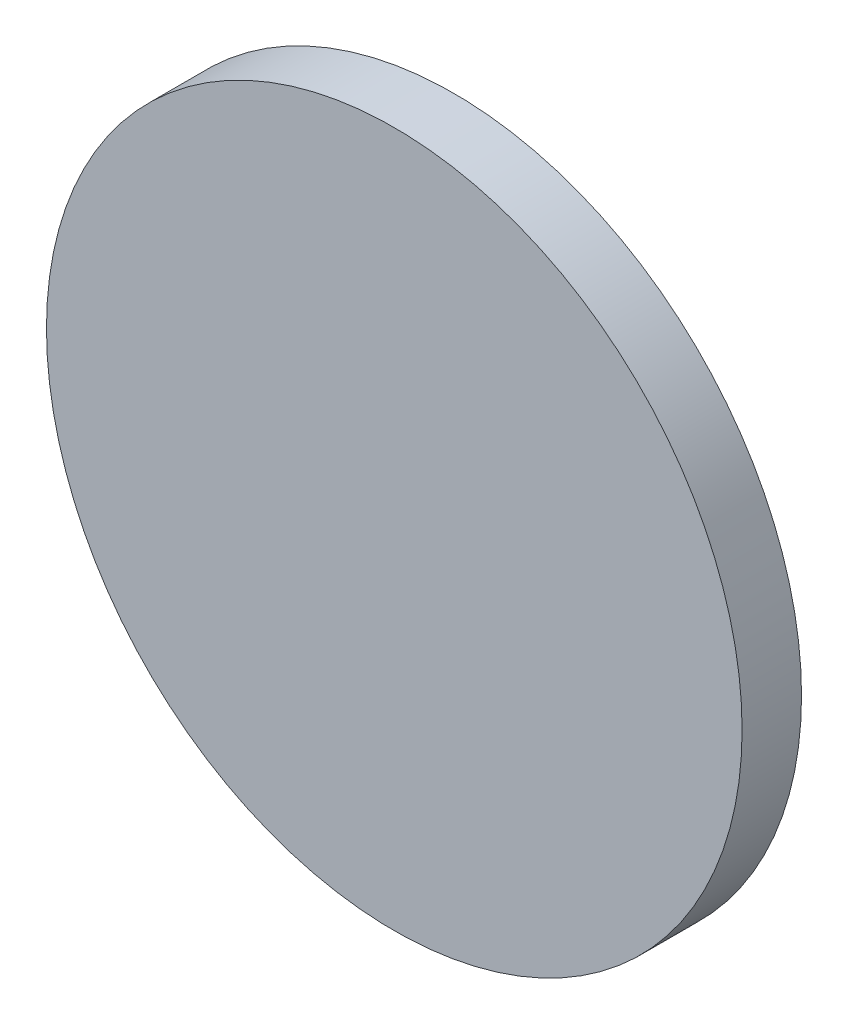
ISO-10303-21;
HEADER;
FILE_DESCRIPTION(('STEP AP214'),'2;1');
FILE_NAME('part.step','',(''),(''),'','','');
FILE_SCHEMA(('AUTOMOTIVE_DESIGN { 1 0 10303 214 1 1 1 1 }'));
ENDSEC;
DATA;
#1=APPLICATION_CONTEXT('core data for automotive mechanical design processes');
#2=APPLICATION_PROTOCOL_DEFINITION('international standard','automotive_design',2000,#1);
#3=PRODUCT_CONTEXT('',#1,'mechanical');
#4=PRODUCT('Part','Part','',(#3));
#5=PRODUCT_RELATED_PRODUCT_CATEGORY('part','',(#4));
#6=PRODUCT_DEFINITION_FORMATION('','',#4);
#7=PRODUCT_DEFINITION_CONTEXT('part definition',#1,'design');
#8=PRODUCT_DEFINITION('design','',#6,#7);
#9=PRODUCT_DEFINITION_SHAPE('','',#8);
#10=(LENGTH_UNIT() NAMED_UNIT(*) SI_UNIT(.MILLI.,.METRE.));
#11=(NAMED_UNIT(*) PLANE_ANGLE_UNIT() SI_UNIT($,.RADIAN.));
#12=(NAMED_UNIT(*) SI_UNIT($,.STERADIAN.) SOLID_ANGLE_UNIT());
#13=UNCERTAINTY_MEASURE_WITH_UNIT(LENGTH_MEASURE(1.E-05),#10,'distance_accuracy_value','');
#14=(GEOMETRIC_REPRESENTATION_CONTEXT(3) GLOBAL_UNCERTAINTY_ASSIGNED_CONTEXT((#13)) GLOBAL_UNIT_ASSIGNED_CONTEXT((#10,
#11,#12)) REPRESENTATION_CONTEXT('',''));
#15=CARTESIAN_POINT('',(0.,0.,0.));
#16=DIRECTION('',(0.,0.,1.));
#17=DIRECTION('',(1.,0.,0.));
#18=AXIS2_PLACEMENT_3D('',#15,#16,#17);
#19=CARTESIAN_POINT('',(0.,0.,0.));
#20=DIRECTION('',(0.,0.,1.));
#21=DIRECTION('',(1.,0.,0.));
#22=AXIS2_PLACEMENT_3D('',#19,#20,#21);
#23=PLANE('',#22);
#24=CARTESIAN_POINT('',(0.,0.,0.));
#25=DIRECTION('',(0.,0.,1.));
#26=DIRECTION('',(1.,0.,0.));
#27=AXIS2_PLACEMENT_3D('',#24,#25,#26);
#28=CIRCLE('',#27,12.875);
#29=CARTESIAN_POINT('',(12.875,0.,0.));
#30=VERTEX_POINT('',#29);
#31=EDGE_CURVE('E38',#30,#30,#28,.T.);
#32=ORIENTED_EDGE('',*,*,#31,.F.);
#33=EDGE_LOOP('',(#32));
#34=FACE_BOUND('',#33,.T.);
#35=CARTESIAN_POINT('',(-0.100160256410254,2.6877912040377,0.));
#36=CARTESIAN_POINT('',(-0.0677293574296633,2.68712604008908,0.));
#37=CARTESIAN_POINT('',(-0.00392926479889619,2.68581748797147,0.));
#38=CARTESIAN_POINT('',(0.0900321637280377,2.67231625999307,0.));
#39=CARTESIAN_POINT('',(0.180223501833134,2.65033360608604,0.));
#40=CARTESIAN_POINT('',(0.266949004442458,2.61984165982839,0.));
#41=CARTESIAN_POINT('',(0.350836809170711,2.58222342443083,0.));
#42=CARTESIAN_POINT('',(0.42983571877148,2.53348907362278,0.));
#43=CARTESIAN_POINT('',(0.505236945989311,2.47679600781176,0.));
#44=CARTESIAN_POINT('',(0.578037313215208,2.41316657565756,0.));
#45=CARTESIAN_POINT('',(0.644294043067198,2.33851658345237,0.));
#46=CARTESIAN_POINT('',(0.703555767099685,2.25373065037043,0.));
#47=CARTESIAN_POINT('',(0.755886208115378,2.15871639167943,0.));
#48=CARTESIAN_POINT('',(0.800615880363975,2.05364002303298,0.));
#49=CARTESIAN_POINT('',(0.837685545352735,1.93822587575256,0.));
#50=CARTESIAN_POINT('',(0.867422697834319,1.81261428829778,0.));
#51=CARTESIAN_POINT('',(0.890412390884992,1.67675059568199,0.));
#52=CARTESIAN_POINT('',(0.899682330160927,1.58242749479046,0.));
#53=CARTESIAN_POINT('',(0.904447115384618,1.53394505019155,0.));
#54=B_SPLINE_CURVE_WITH_KNOTS('',3,(#35,#36,#37,#38,#39,#40,#41,#42,#43,#44,#45,#46,#47,#48,#49,
#50,#51,#52,#53),.UNSPECIFIED.,.F.,.F.,(4,1,1,1,1,1,1,1,1,1,1,1,1,1,1,1,4),(0.,
0.0569713051685908,0.112077514386115,0.16644764094992,0.219897905758325,0.273467231537102,
0.327713706604802,0.382641522400875,0.43917288812717,0.497361289307804,0.557599765805196,
0.620640083609898,0.68767803671055,0.758012520546467,0.833449835749434,0.914392560943234,1.),.UNSPECIFIED.);
#55=CARTESIAN_POINT('',(-0.100160256410254,2.6877912040377,0.));
#56=VERTEX_POINT('',#55);
#57=CARTESIAN_POINT('',(0.904447115384618,1.53394505019155,0.));
#58=VERTEX_POINT('',#57);
#59=EDGE_CURVE('E49',#56,#58,#54,.T.);
#60=ORIENTED_EDGE('',*,*,#59,.T.);
#61=DIRECTION('',(1.,0.,0.));
#62=VECTOR('',#61,1.);
#63=CARTESIAN_POINT('',(0.904447115384618,1.53394505019155,0.));
#64=LINE('',#63,#62);
#65=CARTESIAN_POINT('',(1.53846153846154,1.53394505019155,0.));
#66=VERTEX_POINT('',#65);
#67=EDGE_CURVE('E253',#58,#66,#64,.T.);
#68=ORIENTED_EDGE('',*,*,#67,.T.);
#69=CARTESIAN_POINT('',(1.53846153846154,1.53394505019155,0.));
#70=CARTESIAN_POINT('',(1.5354833818862,1.59845942712152,0.));
#71=CARTESIAN_POINT('',(1.52965851624379,1.72464069668034,0.));
#72=CARTESIAN_POINT('',(1.5037931095433,1.90850090429096,0.));
#73=CARTESIAN_POINT('',(1.4618929934099,2.08174412041221,0.));
#74=CARTESIAN_POINT('',(1.40900620158399,2.24583898541561,0.));
#75=CARTESIAN_POINT('',(1.33845669540867,2.39873422597551,0.));
#76=CARTESIAN_POINT('',(1.2570566774131,2.54309519827962,0.));
#77=CARTESIAN_POINT('',(1.15878815303399,2.6758963800479,0.));
#78=CARTESIAN_POINT('',(1.04773935177357,2.79734785123849,0.));
#79=CARTESIAN_POINT('',(0.927191956156753,2.90769123964974,0.));
#80=CARTESIAN_POINT('',(0.797602941760455,3.00283824785175,0.));
#81=CARTESIAN_POINT('',(0.661162761166241,3.0839175478157,0.));
#82=CARTESIAN_POINT('',(0.517844584933368,3.15007879367759,0.));
#83=CARTESIAN_POINT('',(0.367367739818345,3.20130618314358,0.));
#84=CARTESIAN_POINT('',(0.210161141835722,3.23858307041061,0.));
#85=CARTESIAN_POINT('',(0.0457232842835725,3.26100423262409,0.));
#86=CARTESIAN_POINT('',(-0.0663698368972441,3.26346616675761,0.));
#87=CARTESIAN_POINT('',(-0.123197115384613,3.26471428096078,0.));
#88=B_SPLINE_CURVE_WITH_KNOTS('',3,(#69,#70,#71,#72,#73,#74,#75,#76,#77,#78,#79,#80,#81,#82,#83,
#84,#85,#86,#87),.UNSPECIFIED.,.F.,.F.,(4,1,1,1,1,1,1,1,1,1,1,1,1,1,1,1,4),(0.,
0.0721852611632248,0.141184466632902,0.207190341816113,0.271289738720126,0.333603347161625,
0.395138342452934,0.456287150040092,0.517858367692974,0.578902257442722,0.638706565825344,
0.697285504225467,0.756078148420719,0.814867237218555,0.874716965274665,0.936485898250662,1.),.UNSPECIFIED.);
#89=CARTESIAN_POINT('',(-0.123197115384613,3.26471428096078,0.));
#90=VERTEX_POINT('',#89);
#91=EDGE_CURVE('E255',#66,#90,#88,.T.);
#92=ORIENTED_EDGE('',*,*,#91,.T.);
#93=CARTESIAN_POINT('',(-0.123197115384613,3.26471428096078,0.));
#94=CARTESIAN_POINT('',(-0.182695398263954,3.2634972037967,0.));
#95=CARTESIAN_POINT('',(-0.299447482117152,3.26110896184686,0.));
#96=CARTESIAN_POINT('',(-0.469466636104429,3.23863531386194,0.));
#97=CARTESIAN_POINT('',(-0.630374202536496,3.20239657273054,0.));
#98=CARTESIAN_POINT('',(-0.782217294900485,3.15290748039283,0.));
#99=CARTESIAN_POINT('',(-0.924719266288379,3.08682665294751,0.));
#100=CARTESIAN_POINT('',(-1.05816112149286,3.00714046258432,0.));
#101=CARTESIAN_POINT('',(-1.1812601521052,2.91136053945232,0.));
#102=CARTESIAN_POINT('',(-1.29490980355747,2.80418878598266,0.));
#103=CARTESIAN_POINT('',(-1.39529183336419,2.68629897450236,0.));
#104=CARTESIAN_POINT('',(-1.48595742290482,2.56509424436354,0.));
#105=CARTESIAN_POINT('',(-1.56090131058972,2.43811642554306,0.));
#106=CARTESIAN_POINT('',(-1.62368539737125,2.30768416136182,0.));
#107=CARTESIAN_POINT('',(-1.67199874177686,2.17272694033204,0.));
#108=CARTESIAN_POINT('',(-1.7061174743461,2.03379397862396,0.));
#109=CARTESIAN_POINT('',(-1.72656881295062,1.89079086962642,0.));
#110=CARTESIAN_POINT('',(-1.7293602030282,1.79409365823861,0.));
#111=CARTESIAN_POINT('',(-1.73076923076923,1.74528319121719,0.));
#112=B_SPLINE_CURVE_WITH_KNOTS('',3,(#93,#94,#95,#96,#97,#98,#99,#100,#101,#102,#103,#104,#105,
#106,#107,#108,#109,#110,#111),.UNSPECIFIED.,.F.,.F.,(4,1,1,1,1,1,1,1,1,1,1,1,1,1,1,1,4),(0.,
0.0722951466281056,0.141863069198499,0.208024753889536,0.272578644258576,0.335589612500515,
0.398578358569927,0.461082805887884,0.524813714924765,0.588114162474486,0.649073799790774,
0.7085828346307,0.767034895639372,0.824801028867428,0.882481561455875,0.940679469587159,1.),.UNSPECIFIED.);
#113=CARTESIAN_POINT('',(-1.73076923076923,1.74528319121719,0.));
#114=VERTEX_POINT('',#113);
#115=EDGE_CURVE('E266',#90,#114,#112,.T.);
#116=ORIENTED_EDGE('',*,*,#115,.T.);
#117=CARTESIAN_POINT('',(-1.73076923076923,1.74528319121719,0.));
#118=CARTESIAN_POINT('',(-1.728205226388,1.67700535770398,0.));
#119=CARTESIAN_POINT('',(-1.72311234242089,1.54138504201553,0.));
#120=CARTESIAN_POINT('',(-1.68389555877609,1.3407425684024,0.));
#121=CARTESIAN_POINT('',(-1.61796755073397,1.14656254959108,0.));
#122=CARTESIAN_POINT('',(-1.54181439447558,0.988449086281593,0.));
#123=CARTESIAN_POINT('',(-1.46479466394914,0.860643720398613,0.));
#124=CARTESIAN_POINT('',(-1.39411418457897,0.755151868682702,0.));
#125=CARTESIAN_POINT('',(-1.31108290816852,0.641083153604681,0.));
#126=CARTESIAN_POINT('',(-1.21392018666075,0.519201158958706,0.));
#127=CARTESIAN_POINT('',(-1.1064896048843,0.386717177916649,0.));
#128=CARTESIAN_POINT('',(-0.984523598044958,0.247048885907644,0.));
#129=CARTESIAN_POINT('',(-0.851797198683248,0.0973686004291452,0.));
#130=CARTESIAN_POINT('',(-0.757138795349293,-0.00341918329715651,0.));
#131=CARTESIAN_POINT('',(-0.70813301282051,-0.0555982190392204,0.));
#132=B_SPLINE_CURVE_WITH_KNOTS('',3,(#117,#118,#119,#120,#121,#122,#123,#124,#125,#126,#127,
#128,#129,#130,#131),.UNSPECIFIED.,.F.,.F.,(4,1,1,1,1,1,1,1,1,1,1,1,4),(0.,0.0963129234548145,
0.191306437414885,0.287260269542857,0.385041783312048,0.438291931212015,0.49775044955736,
0.56419160247439,0.637336305933295,0.717694708156951,0.8048808745673,0.898984505428149,1.),.UNSPECIFIED.);
#133=CARTESIAN_POINT('',(-0.70813301282051,-0.0555982190392204,0.));
#134=VERTEX_POINT('',#133);
#135=EDGE_CURVE('E274',#114,#134,#132,.T.);
#136=ORIENTED_EDGE('',*,*,#135,.T.);
#137=DIRECTION('',(0.706818929896773,-0.707394515344572,0.));
#138=VECTOR('',#137,1.);
#139=CARTESIAN_POINT('',(-0.70813301282051,-0.0555982190392204,0.));
#140=LINE('',#139,#138);
#141=CARTESIAN_POINT('',(0.521834935897439,-1.28656777032127,0.));
#142=VERTEX_POINT('',#141);
#143=EDGE_CURVE('E282',#134,#142,#140,.T.);
#144=ORIENTED_EDGE('',*,*,#143,.T.);
#145=DIRECTION('',(-1.,0.,0.));
#146=VECTOR('',#145,1.);
#147=CARTESIAN_POINT('',(0.521834935897439,-1.28656777032127,0.));
#148=LINE('',#147,#146);
#149=CARTESIAN_POINT('',(-1.79487179487179,-1.28656777032127,0.));
#150=VERTEX_POINT('',#149);
#151=EDGE_CURVE('E288',#142,#150,#148,.T.);
#152=ORIENTED_EDGE('',*,*,#151,.T.);
#153=DIRECTION('',(0.,-1.,0.));
#154=VECTOR('',#153,1.);
#155=CARTESIAN_POINT('',(-1.79487179487179,-1.28656777032127,0.));
#156=LINE('',#155,#154);
#157=CARTESIAN_POINT('',(-1.79487179487179,-1.86349084724435,0.));
#158=VERTEX_POINT('',#157);
#159=EDGE_CURVE('E225',#150,#158,#156,.T.);
#160=ORIENTED_EDGE('',*,*,#159,.T.);
#161=DIRECTION('',(1.,0.,0.));
#162=VECTOR('',#161,1.);
#163=CARTESIAN_POINT('',(-1.79487179487179,-1.86349084724435,0.));
#164=LINE('',#163,#162);
#165=CARTESIAN_POINT('',(1.73076923076923,-1.86349084724435,0.));
#166=VERTEX_POINT('',#165);
#167=EDGE_CURVE('E291',#158,#166,#164,.T.);
#168=ORIENTED_EDGE('',*,*,#167,.T.);
#169=DIRECTION('',(-0.671272146490602,0.74121097222444,0.));
#170=VECTOR('',#169,1.);
#171=CARTESIAN_POINT('',(1.73076923076923,-1.86349084724435,0.));
#172=LINE('',#171,#170);
#173=CARTESIAN_POINT('',(-0.182291666666664,0.248888960447959,0.));
#174=VERTEX_POINT('',#173);
#175=EDGE_CURVE('E294',#166,#174,#172,.T.);
#176=ORIENTED_EDGE('',*,*,#175,.T.);
#177=CARTESIAN_POINT('',(-0.182291666666664,0.248888960447959,0.));
#178=CARTESIAN_POINT('',(-0.227858241279823,0.297485201840837,0.));
#179=CARTESIAN_POINT('',(-0.315301330810887,0.39074227729727,0.));
#180=CARTESIAN_POINT('',(-0.438539985432316,0.527255660923666,0.));
#181=CARTESIAN_POINT('',(-0.549728841720962,0.653460153928452,0.));
#182=CARTESIAN_POINT('',(-0.649460689789069,0.769264649351721,0.));
#183=CARTESIAN_POINT('',(-0.735123959476961,0.876225682505221,0.));
#184=CARTESIAN_POINT('',(-0.809023163684256,0.972769670324271,0.));
#185=CARTESIAN_POINT('',(-0.870321749034341,1.05935251182515,0.));
#186=CARTESIAN_POINT('',(-0.933980621959448,1.16126772350968,0.));
#187=CARTESIAN_POINT('',(-0.997060035280609,1.28343634884434,0.));
#188=CARTESIAN_POINT('',(-1.0507205511501,1.43246491726342,0.));
#189=CARTESIAN_POINT('',(-1.08291948925746,1.58465541285646,0.));
#190=CARTESIAN_POINT('',(-1.08746777648901,1.68704139642994,0.));
#191=CARTESIAN_POINT('',(-1.08974358974359,1.73827197326847,0.));
#192=B_SPLINE_CURVE_WITH_KNOTS('',3,(#177,#178,#179,#180,#181,#182,#183,#184,#185,#186,#187,
#188,#189,#190,#191),.UNSPECIFIED.,.F.,.F.,(4,1,1,1,1,1,1,1,1,1,1,1,4),(0.,0.111796703885442,
0.214539918133527,0.308625582047601,0.394072981184506,0.470989580125928,0.538563461408387,
0.598097997336716,0.648937472604036,0.74014971500445,0.828231221971265,0.914052556081116,1.),.UNSPECIFIED.);
#193=CARTESIAN_POINT('',(-1.08974358974359,1.73827197326847,0.));
#194=VERTEX_POINT('',#193);
#195=EDGE_CURVE('E147',#174,#194,#192,.T.);
#196=ORIENTED_EDGE('',*,*,#195,.T.);
#197=CARTESIAN_POINT('',(-1.08974358974359,1.73827197326847,0.));
#198=CARTESIAN_POINT('',(-1.08918273377242,1.77005348340467,0.));
#199=CARTESIAN_POINT('',(-1.0880729666428,1.83293963794641,0.));
#200=CARTESIAN_POINT('',(-1.07294311876864,1.92502887008735,0.));
#201=CARTESIAN_POINT('',(-1.05163001095641,2.01435030095637,0.));
#202=CARTESIAN_POINT('',(-1.01866608743565,2.09946791096606,0.));
#203=CARTESIAN_POINT('',(-0.978950624722071,2.18205629727652,0.));
#204=CARTESIAN_POINT('',(-0.929273646885784,2.26104782397619,0.));
#205=CARTESIAN_POINT('',(-0.869620429772418,2.33570975940036,0.));
#206=CARTESIAN_POINT('',(-0.803261839382972,2.40772195032099,0.));
#207=CARTESIAN_POINT('',(-0.729867494342452,2.47274080257443,0.));
#208=CARTESIAN_POINT('',(-0.652345526443416,2.53105320288916,0.));
#209=CARTESIAN_POINT('',(-0.569742602578778,2.57841045768296,0.));
#210=CARTESIAN_POINT('',(-0.484317210757217,2.61982520592846,0.));
#211=CARTESIAN_POINT('',(-0.393413852022037,2.64918555307837,0.));
#212=CARTESIAN_POINT('',(-0.299267039244678,2.67104584078546,0.));
#213=CARTESIAN_POINT('',(-0.201137531585903,2.68618890326668,0.));
#214=CARTESIAN_POINT('',(-0.134273090165469,2.68724990383196,0.));
#215=CARTESIAN_POINT('',(-0.100160256410254,2.6877912040377,0.));
#216=B_SPLINE_CURVE_WITH_KNOTS('',3,(#197,#198,#199,#200,#201,#202,#203,#204,#205,#206,#207,
#208,#209,#210,#211,#212,#213,#214,#215),.UNSPECIFIED.,.F.,.F.,(4,1,1,1,1,1,1,1,1,1,1,1,1,1,1,1,
4),(0.,0.0624645579460316,0.123598778898253,0.183188668078302,0.242854553261222,
0.302791066145277,0.363304438937391,0.42599313827914,0.490604073915262,0.555743866473249,
0.618679913682442,0.681099546765629,0.742813418463334,0.805136180313869,0.86855722512849,
0.932940656763705,1.),.UNSPECIFIED.);
#217=EDGE_CURVE('E254',#194,#56,#216,.T.);
#218=ORIENTED_EDGE('',*,*,#217,.T.);
#219=EDGE_LOOP('',(#60,#68,#92,#116,#136,#144,#152,#160,#168,#176,#196,#218));
#220=FACE_BOUND('',#219,.T.);
#221=ADVANCED_FACE('F34',(#34,#220),#23,.F.);
#222=CARTESIAN_POINT('',(0.,0.,2.2));
#223=DIRECTION('',(0.,0.,-1.));
#224=DIRECTION('',(-1.,0.,0.));
#225=AXIS2_PLACEMENT_3D('',#222,#223,#224);
#226=CYLINDRICAL_SURFACE('',#225,12.875);
#227=CARTESIAN_POINT('',(0.,0.,2.2));
#228=DIRECTION('',(0.,0.,1.));
#229=DIRECTION('',(1.,0.,0.));
#230=AXIS2_PLACEMENT_3D('',#227,#228,#229);
#231=CIRCLE('',#230,12.875);
#232=CARTESIAN_POINT('',(12.875,0.,2.2));
#233=VERTEX_POINT('',#232);
#234=EDGE_CURVE('E11',#233,#233,#231,.T.);
#235=ORIENTED_EDGE('',*,*,#234,.F.);
#236=EDGE_LOOP('',(#235));
#237=FACE_BOUND('',#236,.T.);
#238=ORIENTED_EDGE('',*,*,#31,.T.);
#239=EDGE_LOOP('',(#238));
#240=FACE_BOUND('',#239,.T.);
#241=ADVANCED_FACE('F36',(#237,#240),#226,.T.);
#242=CARTESIAN_POINT('',(0.,0.,2.2));
#243=DIRECTION('',(0.,0.,1.));
#244=DIRECTION('',(1.,0.,0.));
#245=AXIS2_PLACEMENT_3D('',#242,#243,#244);
#246=PLANE('',#245);
#247=ORIENTED_EDGE('',*,*,#234,.T.);
#248=EDGE_LOOP('',(#247));
#249=FACE_BOUND('',#248,.T.);
#250=ADVANCED_FACE('F325',(#249),#246,.T.);
#251=CARTESIAN_POINT('',(-0.100160256410254,2.6877912040377,0.15));
#252=CARTESIAN_POINT('',(-0.0677293574296633,2.68712604008908,0.15));
#253=CARTESIAN_POINT('',(-0.00392926479889619,2.68581748797147,0.15));
#254=CARTESIAN_POINT('',(0.0900321637280377,2.67231625999307,0.15));
#255=CARTESIAN_POINT('',(0.180223501833134,2.65033360608604,0.15));
#256=CARTESIAN_POINT('',(0.266949004442458,2.61984165982839,0.15));
#257=CARTESIAN_POINT('',(0.350836809170711,2.58222342443083,0.15));
#258=CARTESIAN_POINT('',(0.42983571877148,2.53348907362278,0.15));
#259=CARTESIAN_POINT('',(0.505236945989311,2.47679600781176,0.15));
#260=CARTESIAN_POINT('',(0.578037313215208,2.41316657565756,0.15));
#261=CARTESIAN_POINT('',(0.644294043067198,2.33851658345237,0.15));
#262=CARTESIAN_POINT('',(0.703555767099685,2.25373065037043,0.15));
#263=CARTESIAN_POINT('',(0.755886208115378,2.15871639167943,0.15));
#264=CARTESIAN_POINT('',(0.800615880363975,2.05364002303298,0.15));
#265=CARTESIAN_POINT('',(0.837685545352735,1.93822587575256,0.15));
#266=CARTESIAN_POINT('',(0.867422697834319,1.81261428829778,0.15));
#267=CARTESIAN_POINT('',(0.890412390884992,1.67675059568199,0.15));
#268=CARTESIAN_POINT('',(0.899682330160927,1.58242749479046,0.15));
#269=CARTESIAN_POINT('',(0.904447115384618,1.53394505019155,0.15));
#270=B_SPLINE_CURVE_WITH_KNOTS('',3,(#251,#252,#253,#254,#255,#256,#257,#258,#259,#260,#261,
#262,#263,#264,#265,#266,#267,#268,#269),.UNSPECIFIED.,.F.,.F.,(4,1,1,1,1,1,1,1,1,1,1,1,1,1,1,1,
4),(0.,0.0569713051685908,0.112077514386115,0.16644764094992,0.219897905758325,
0.273467231537102,0.327713706604802,0.382641522400875,0.43917288812717,0.497361289307804,
0.557599765805196,0.620640083609898,0.68767803671055,0.758012520546467,0.833449835749434,
0.914392560943234,1.),.UNSPECIFIED.);
#271=DIRECTION('',(0.,0.,-1.));
#272=VECTOR('',#271,1.);
#273=SURFACE_OF_LINEAR_EXTRUSION('',#270,#272);
#274=ORIENTED_EDGE('',*,*,#59,.F.);
#275=DIRECTION('',(0.,0.,-1.));
#276=VECTOR('',#275,1.);
#277=CARTESIAN_POINT('',(-0.100160256410254,2.6877912040377,0.15));
#278=LINE('',#277,#276);
#279=CARTESIAN_POINT('',(-0.100160256410254,2.6877912040377,0.15));
#280=VERTEX_POINT('',#279);
#281=EDGE_CURVE('E152',#280,#56,#278,.T.);
#282=ORIENTED_EDGE('',*,*,#281,.F.);
#283=CARTESIAN_POINT('',(0.904447115384618,1.53394505019155,0.15));
#284=VERTEX_POINT('',#283);
#285=EDGE_CURVE('E305',#280,#284,#270,.T.);
#286=ORIENTED_EDGE('',*,*,#285,.T.);
#287=DIRECTION('',(0.,0.,-1.));
#288=VECTOR('',#287,1.);
#289=CARTESIAN_POINT('',(0.904447115384618,1.53394505019155,0.15));
#290=LINE('',#289,#288);
#291=EDGE_CURVE('E242',#284,#58,#290,.T.);
#292=ORIENTED_EDGE('',*,*,#291,.T.);
#293=EDGE_LOOP('',(#274,#282,#286,#292));
#294=FACE_BOUND('',#293,.T.);
#295=ADVANCED_FACE('F310',(#294),#273,.T.);
#296=CARTESIAN_POINT('',(0.904447115384618,1.53394505019155,0.15));
#297=DIRECTION('',(0.,1.,0.));
#298=DIRECTION('',(0.,0.,1.));
#299=AXIS2_PLACEMENT_3D('',#296,#297,#298);
#300=PLANE('',#299);
#301=ORIENTED_EDGE('',*,*,#67,.F.);
#302=ORIENTED_EDGE('',*,*,#291,.F.);
#303=DIRECTION('',(1.,0.,0.));
#304=VECTOR('',#303,1.);
#305=CARTESIAN_POINT('',(0.904447115384618,1.53394505019155,0.15));
#306=LINE('',#305,#304);
#307=CARTESIAN_POINT('',(1.53846153846154,1.53394505019155,0.15));
#308=VERTEX_POINT('',#307);
#309=EDGE_CURVE('E106',#284,#308,#306,.T.);
#310=ORIENTED_EDGE('',*,*,#309,.T.);
#311=DIRECTION('',(0.,0.,-1.));
#312=VECTOR('',#311,1.);
#313=CARTESIAN_POINT('',(1.53846153846154,1.53394505019155,0.15));
#314=LINE('',#313,#312);
#315=EDGE_CURVE('E240',#308,#66,#314,.T.);
#316=ORIENTED_EDGE('',*,*,#315,.T.);
#317=EDGE_LOOP('',(#301,#302,#310,#316));
#318=FACE_BOUND('',#317,.T.);
#319=ADVANCED_FACE('F324',(#318),#300,.T.);
#320=CARTESIAN_POINT('',(1.53846153846154,1.53394505019155,0.15));
#321=CARTESIAN_POINT('',(1.5354833818862,1.59845942712152,0.15));
#322=CARTESIAN_POINT('',(1.52965851624379,1.72464069668034,0.15));
#323=CARTESIAN_POINT('',(1.5037931095433,1.90850090429096,0.15));
#324=CARTESIAN_POINT('',(1.4618929934099,2.08174412041221,0.15));
#325=CARTESIAN_POINT('',(1.40900620158399,2.24583898541561,0.15));
#326=CARTESIAN_POINT('',(1.33845669540867,2.39873422597551,0.15));
#327=CARTESIAN_POINT('',(1.2570566774131,2.54309519827962,0.15));
#328=CARTESIAN_POINT('',(1.15878815303399,2.6758963800479,0.15));
#329=CARTESIAN_POINT('',(1.04773935177357,2.79734785123849,0.15));
#330=CARTESIAN_POINT('',(0.927191956156753,2.90769123964974,0.15));
#331=CARTESIAN_POINT('',(0.797602941760455,3.00283824785175,0.15));
#332=CARTESIAN_POINT('',(0.661162761166241,3.0839175478157,0.15));
#333=CARTESIAN_POINT('',(0.517844584933368,3.15007879367759,0.15));
#334=CARTESIAN_POINT('',(0.367367739818345,3.20130618314358,0.15));
#335=CARTESIAN_POINT('',(0.210161141835722,3.23858307041061,0.15));
#336=CARTESIAN_POINT('',(0.0457232842835725,3.26100423262409,0.15));
#337=CARTESIAN_POINT('',(-0.0663698368972441,3.26346616675761,0.15));
#338=CARTESIAN_POINT('',(-0.123197115384613,3.26471428096078,0.15));
#339=B_SPLINE_CURVE_WITH_KNOTS('',3,(#320,#321,#322,#323,#324,#325,#326,#327,#328,#329,#330,
#331,#332,#333,#334,#335,#336,#337,#338),.UNSPECIFIED.,.F.,.F.,(4,1,1,1,1,1,1,1,1,1,1,1,1,1,1,1,
4),(0.,0.0721852611632248,0.141184466632902,0.207190341816113,0.271289738720126,
0.333603347161625,0.395138342452934,0.456287150040092,0.517858367692974,0.578902257442722,
0.638706565825344,0.697285504225467,0.756078148420719,0.814867237218555,0.874716965274665,
0.936485898250662,1.),.UNSPECIFIED.);
#340=DIRECTION('',(0.,0.,-1.));
#341=VECTOR('',#340,1.);
#342=SURFACE_OF_LINEAR_EXTRUSION('',#339,#341);
#343=ORIENTED_EDGE('',*,*,#91,.F.);
#344=ORIENTED_EDGE('',*,*,#315,.F.);
#345=CARTESIAN_POINT('',(-0.123197115384613,3.26471428096078,0.15));
#346=VERTEX_POINT('',#345);
#347=EDGE_CURVE('E312',#308,#346,#339,.T.);
#348=ORIENTED_EDGE('',*,*,#347,.T.);
#349=DIRECTION('',(0.,0.,-1.));
#350=VECTOR('',#349,1.);
#351=CARTESIAN_POINT('',(-0.123197115384613,3.26471428096078,0.15));
#352=LINE('',#351,#350);
#353=EDGE_CURVE('E238',#346,#90,#352,.T.);
#354=ORIENTED_EDGE('',*,*,#353,.T.);
#355=EDGE_LOOP('',(#343,#344,#348,#354));
#356=FACE_BOUND('',#355,.T.);
#357=ADVANCED_FACE('F356',(#356),#342,.T.);
#358=CARTESIAN_POINT('',(-0.123197115384613,3.26471428096078,0.15));
#359=CARTESIAN_POINT('',(-0.182695398263954,3.2634972037967,0.15));
#360=CARTESIAN_POINT('',(-0.299447482117152,3.26110896184686,0.15));
#361=CARTESIAN_POINT('',(-0.469466636104429,3.23863531386194,0.15));
#362=CARTESIAN_POINT('',(-0.630374202536496,3.20239657273054,0.15));
#363=CARTESIAN_POINT('',(-0.782217294900485,3.15290748039283,0.15));
#364=CARTESIAN_POINT('',(-0.924719266288379,3.08682665294751,0.15));
#365=CARTESIAN_POINT('',(-1.05816112149286,3.00714046258432,0.15));
#366=CARTESIAN_POINT('',(-1.1812601521052,2.91136053945232,0.15));
#367=CARTESIAN_POINT('',(-1.29490980355747,2.80418878598266,0.15));
#368=CARTESIAN_POINT('',(-1.39529183336419,2.68629897450236,0.15));
#369=CARTESIAN_POINT('',(-1.48595742290482,2.56509424436354,0.15));
#370=CARTESIAN_POINT('',(-1.56090131058972,2.43811642554306,0.15));
#371=CARTESIAN_POINT('',(-1.62368539737125,2.30768416136182,0.15));
#372=CARTESIAN_POINT('',(-1.67199874177686,2.17272694033204,0.15));
#373=CARTESIAN_POINT('',(-1.7061174743461,2.03379397862396,0.15));
#374=CARTESIAN_POINT('',(-1.72656881295062,1.89079086962642,0.15));
#375=CARTESIAN_POINT('',(-1.7293602030282,1.79409365823861,0.15));
#376=CARTESIAN_POINT('',(-1.73076923076923,1.74528319121719,0.15));
#377=B_SPLINE_CURVE_WITH_KNOTS('',3,(#358,#359,#360,#361,#362,#363,#364,#365,#366,#367,#368,
#369,#370,#371,#372,#373,#374,#375,#376),.UNSPECIFIED.,.F.,.F.,(4,1,1,1,1,1,1,1,1,1,1,1,1,1,1,1,
4),(0.,0.0722951466281056,0.141863069198499,0.208024753889536,0.272578644258576,
0.335589612500515,0.398578358569927,0.461082805887884,0.524813714924765,0.588114162474486,
0.649073799790774,0.7085828346307,0.767034895639372,0.824801028867428,0.882481561455875,
0.940679469587159,1.),.UNSPECIFIED.);
#378=DIRECTION('',(0.,0.,-1.));
#379=VECTOR('',#378,1.);
#380=SURFACE_OF_LINEAR_EXTRUSION('',#377,#379);
#381=ORIENTED_EDGE('',*,*,#115,.F.);
#382=ORIENTED_EDGE('',*,*,#353,.F.);
#383=CARTESIAN_POINT('',(-1.73076923076923,1.74528319121719,0.15));
#384=VERTEX_POINT('',#383);
#385=EDGE_CURVE('E203',#346,#384,#377,.T.);
#386=ORIENTED_EDGE('',*,*,#385,.T.);
#387=DIRECTION('',(0.,0.,-1.));
#388=VECTOR('',#387,1.);
#389=CARTESIAN_POINT('',(-1.73076923076923,1.74528319121719,0.15));
#390=LINE('',#389,#388);
#391=EDGE_CURVE('E236',#384,#114,#390,.T.);
#392=ORIENTED_EDGE('',*,*,#391,.T.);
#393=EDGE_LOOP('',(#381,#382,#386,#392));
#394=FACE_BOUND('',#393,.T.);
#395=ADVANCED_FACE('F193',(#394),#380,.T.);
#396=CARTESIAN_POINT('',(-1.73076923076923,1.74528319121719,0.15));
#397=CARTESIAN_POINT('',(-1.728205226388,1.67700535770398,0.15));
#398=CARTESIAN_POINT('',(-1.72311234242089,1.54138504201553,0.15));
#399=CARTESIAN_POINT('',(-1.68389555877609,1.3407425684024,0.15));
#400=CARTESIAN_POINT('',(-1.61796755073397,1.14656254959108,0.15));
#401=CARTESIAN_POINT('',(-1.54181439447558,0.988449086281593,0.15));
#402=CARTESIAN_POINT('',(-1.46479466394914,0.860643720398613,0.15));
#403=CARTESIAN_POINT('',(-1.39411418457897,0.755151868682702,0.15));
#404=CARTESIAN_POINT('',(-1.31108290816852,0.641083153604681,0.15));
#405=CARTESIAN_POINT('',(-1.21392018666075,0.519201158958706,0.15));
#406=CARTESIAN_POINT('',(-1.1064896048843,0.386717177916649,0.15));
#407=CARTESIAN_POINT('',(-0.984523598044958,0.247048885907644,0.15));
#408=CARTESIAN_POINT('',(-0.851797198683248,0.0973686004291452,0.15));
#409=CARTESIAN_POINT('',(-0.757138795349293,-0.00341918329715651,0.15));
#410=CARTESIAN_POINT('',(-0.70813301282051,-0.0555982190392204,0.15));
#411=B_SPLINE_CURVE_WITH_KNOTS('',3,(#396,#397,#398,#399,#400,#401,#402,#403,#404,#405,#406,
#407,#408,#409,#410),.UNSPECIFIED.,.F.,.F.,(4,1,1,1,1,1,1,1,1,1,1,1,4),(0.,0.0963129234548145,
0.191306437414885,0.287260269542857,0.385041783312048,0.438291931212015,0.49775044955736,
0.56419160247439,0.637336305933295,0.717694708156951,0.8048808745673,0.898984505428149,1.),.UNSPECIFIED.);
#412=DIRECTION('',(0.,0.,-1.));
#413=VECTOR('',#412,1.);
#414=SURFACE_OF_LINEAR_EXTRUSION('',#411,#413);
#415=ORIENTED_EDGE('',*,*,#135,.F.);
#416=ORIENTED_EDGE('',*,*,#391,.F.);
#417=CARTESIAN_POINT('',(-0.70813301282051,-0.0555982190392204,0.15));
#418=VERTEX_POINT('',#417);
#419=EDGE_CURVE('E197',#384,#418,#411,.T.);
#420=ORIENTED_EDGE('',*,*,#419,.T.);
#421=DIRECTION('',(0.,0.,-1.));
#422=VECTOR('',#421,1.);
#423=CARTESIAN_POINT('',(-0.70813301282051,-0.0555982190392204,0.15));
#424=LINE('',#423,#422);
#425=EDGE_CURVE('E230',#418,#134,#424,.T.);
#426=ORIENTED_EDGE('',*,*,#425,.T.);
#427=EDGE_LOOP('',(#415,#416,#420,#426));
#428=FACE_BOUND('',#427,.T.);
#429=ADVANCED_FACE('F188',(#428),#414,.T.);
#430=CARTESIAN_POINT('',(-0.70813301282051,-0.0555982190392204,0.15));
#431=DIRECTION('',(0.707394515344572,0.706818929896773,0.));
#432=DIRECTION('',(-0.706818929896773,0.707394515344572,0.));
#433=AXIS2_PLACEMENT_3D('',#430,#431,#432);
#434=PLANE('',#433);
#435=ORIENTED_EDGE('',*,*,#143,.F.);
#436=ORIENTED_EDGE('',*,*,#425,.F.);
#437=DIRECTION('',(0.706818929896773,-0.707394515344572,0.));
#438=VECTOR('',#437,1.);
#439=CARTESIAN_POINT('',(-0.70813301282051,-0.0555982190392204,0.15));
#440=LINE('',#439,#438);
#441=CARTESIAN_POINT('',(0.521834935897439,-1.28656777032127,0.15));
#442=VERTEX_POINT('',#441);
#443=EDGE_CURVE('E202',#418,#442,#440,.T.);
#444=ORIENTED_EDGE('',*,*,#443,.T.);
#445=DIRECTION('',(0.,0.,-1.));
#446=VECTOR('',#445,1.);
#447=CARTESIAN_POINT('',(0.521834935897439,-1.28656777032127,0.15));
#448=LINE('',#447,#446);
#449=EDGE_CURVE('E228',#442,#142,#448,.T.);
#450=ORIENTED_EDGE('',*,*,#449,.T.);
#451=EDGE_LOOP('',(#435,#436,#444,#450));
#452=FACE_BOUND('',#451,.T.);
#453=ADVANCED_FACE('F184',(#452),#434,.T.);
#454=CARTESIAN_POINT('',(0.521834935897439,-1.28656777032127,0.15));
#455=DIRECTION('',(0.,-1.,0.));
#456=DIRECTION('',(0.,0.,-1.));
#457=AXIS2_PLACEMENT_3D('',#454,#455,#456);
#458=PLANE('',#457);
#459=ORIENTED_EDGE('',*,*,#151,.F.);
#460=ORIENTED_EDGE('',*,*,#449,.F.);
#461=DIRECTION('',(-1.,0.,0.));
#462=VECTOR('',#461,1.);
#463=CARTESIAN_POINT('',(0.521834935897439,-1.28656777032127,0.15));
#464=LINE('',#463,#462);
#465=CARTESIAN_POINT('',(-1.79487179487179,-1.28656777032127,0.15));
#466=VERTEX_POINT('',#465);
#467=EDGE_CURVE('E212',#442,#466,#464,.T.);
#468=ORIENTED_EDGE('',*,*,#467,.T.);
#469=DIRECTION('',(0.,0.,-1.));
#470=VECTOR('',#469,1.);
#471=CARTESIAN_POINT('',(-1.79487179487179,-1.28656777032127,0.15));
#472=LINE('',#471,#470);
#473=EDGE_CURVE('E223',#466,#150,#472,.T.);
#474=ORIENTED_EDGE('',*,*,#473,.T.);
#475=EDGE_LOOP('',(#459,#460,#468,#474));
#476=FACE_BOUND('',#475,.T.);
#477=ADVANCED_FACE('F180',(#476),#458,.T.);
#478=CARTESIAN_POINT('',(-1.79487179487179,-1.28656777032127,0.15));
#479=DIRECTION('',(1.,0.,0.));
#480=DIRECTION('',(0.,0.,-1.));
#481=AXIS2_PLACEMENT_3D('',#478,#479,#480);
#482=PLANE('',#481);
#483=ORIENTED_EDGE('',*,*,#159,.F.);
#484=ORIENTED_EDGE('',*,*,#473,.F.);
#485=DIRECTION('',(0.,-1.,0.));
#486=VECTOR('',#485,1.);
#487=CARTESIAN_POINT('',(-1.79487179487179,-1.28656777032127,0.15));
#488=LINE('',#487,#486);
#489=CARTESIAN_POINT('',(-1.79487179487179,-1.86349084724435,0.15));
#490=VERTEX_POINT('',#489);
#491=EDGE_CURVE('E214',#466,#490,#488,.T.);
#492=ORIENTED_EDGE('',*,*,#491,.T.);
#493=DIRECTION('',(0.,0.,-1.));
#494=VECTOR('',#493,1.);
#495=CARTESIAN_POINT('',(-1.79487179487179,-1.86349084724435,0.15));
#496=LINE('',#495,#494);
#497=EDGE_CURVE('E217',#490,#158,#496,.T.);
#498=ORIENTED_EDGE('',*,*,#497,.T.);
#499=EDGE_LOOP('',(#483,#484,#492,#498));
#500=FACE_BOUND('',#499,.T.);
#501=ADVANCED_FACE('F176',(#500),#482,.T.);
#502=CARTESIAN_POINT('',(-1.79487179487179,-1.86349084724435,0.15));
#503=DIRECTION('',(0.,1.,0.));
#504=DIRECTION('',(0.,0.,1.));
#505=AXIS2_PLACEMENT_3D('',#502,#503,#504);
#506=PLANE('',#505);
#507=ORIENTED_EDGE('',*,*,#167,.F.);
#508=ORIENTED_EDGE('',*,*,#497,.F.);
#509=DIRECTION('',(1.,0.,0.));
#510=VECTOR('',#509,1.);
#511=CARTESIAN_POINT('',(-1.79487179487179,-1.86349084724435,0.15));
#512=LINE('',#511,#510);
#513=CARTESIAN_POINT('',(1.73076923076923,-1.86349084724435,0.15));
#514=VERTEX_POINT('',#513);
#515=EDGE_CURVE('E143',#490,#514,#512,.T.);
#516=ORIENTED_EDGE('',*,*,#515,.T.);
#517=DIRECTION('',(0.,0.,-1.));
#518=VECTOR('',#517,1.);
#519=CARTESIAN_POINT('',(1.73076923076923,-1.86349084724435,0.15));
#520=LINE('',#519,#518);
#521=EDGE_CURVE('E139',#514,#166,#520,.T.);
#522=ORIENTED_EDGE('',*,*,#521,.T.);
#523=EDGE_LOOP('',(#507,#508,#516,#522));
#524=FACE_BOUND('',#523,.T.);
#525=ADVANCED_FACE('F173',(#524),#506,.T.);
#526=CARTESIAN_POINT('',(1.73076923076923,-1.86349084724435,0.15));
#527=DIRECTION('',(-0.74121097222444,-0.671272146490602,0.));
#528=DIRECTION('',(0.671272146490602,-0.74121097222444,0.));
#529=AXIS2_PLACEMENT_3D('',#526,#527,#528);
#530=PLANE('',#529);
#531=ORIENTED_EDGE('',*,*,#175,.F.);
#532=ORIENTED_EDGE('',*,*,#521,.F.);
#533=DIRECTION('',(-0.671272146490602,0.74121097222444,0.));
#534=VECTOR('',#533,1.);
#535=CARTESIAN_POINT('',(1.73076923076923,-1.86349084724435,0.15));
#536=LINE('',#535,#534);
#537=CARTESIAN_POINT('',(-0.182291666666664,0.248888960447959,0.15));
#538=VERTEX_POINT('',#537);
#539=EDGE_CURVE('E134',#514,#538,#536,.T.);
#540=ORIENTED_EDGE('',*,*,#539,.T.);
#541=DIRECTION('',(0.,0.,-1.));
#542=VECTOR('',#541,1.);
#543=CARTESIAN_POINT('',(-0.182291666666664,0.248888960447959,0.15));
#544=LINE('',#543,#542);
#545=EDGE_CURVE('E138',#538,#174,#544,.T.);
#546=ORIENTED_EDGE('',*,*,#545,.T.);
#547=EDGE_LOOP('',(#531,#532,#540,#546));
#548=FACE_BOUND('',#547,.T.);
#549=ADVANCED_FACE('F137',(#548),#530,.T.);
#550=CARTESIAN_POINT('',(-0.182291666666664,0.248888960447959,0.15));
#551=CARTESIAN_POINT('',(-0.227858241279823,0.297485201840837,0.15));
#552=CARTESIAN_POINT('',(-0.315301330810887,0.39074227729727,0.15));
#553=CARTESIAN_POINT('',(-0.438539985432316,0.527255660923666,0.15));
#554=CARTESIAN_POINT('',(-0.549728841720962,0.653460153928452,0.15));
#555=CARTESIAN_POINT('',(-0.649460689789069,0.769264649351721,0.15));
#556=CARTESIAN_POINT('',(-0.735123959476961,0.876225682505221,0.15));
#557=CARTESIAN_POINT('',(-0.809023163684256,0.972769670324271,0.15));
#558=CARTESIAN_POINT('',(-0.870321749034341,1.05935251182515,0.15));
#559=CARTESIAN_POINT('',(-0.933980621959448,1.16126772350968,0.15));
#560=CARTESIAN_POINT('',(-0.997060035280609,1.28343634884434,0.15));
#561=CARTESIAN_POINT('',(-1.0507205511501,1.43246491726342,0.15));
#562=CARTESIAN_POINT('',(-1.08291948925746,1.58465541285646,0.15));
#563=CARTESIAN_POINT('',(-1.08746777648901,1.68704139642994,0.15));
#564=CARTESIAN_POINT('',(-1.08974358974359,1.73827197326847,0.15));
#565=B_SPLINE_CURVE_WITH_KNOTS('',3,(#550,#551,#552,#553,#554,#555,#556,#557,#558,#559,#560,
#561,#562,#563,#564),.UNSPECIFIED.,.F.,.F.,(4,1,1,1,1,1,1,1,1,1,1,1,4),(0.,0.111796703885442,
0.214539918133527,0.308625582047601,0.394072981184506,0.470989580125928,0.538563461408387,
0.598097997336716,0.648937472604036,0.74014971500445,0.828231221971265,0.914052556081116,1.),.UNSPECIFIED.);
#566=DIRECTION('',(0.,0.,-1.));
#567=VECTOR('',#566,1.);
#568=SURFACE_OF_LINEAR_EXTRUSION('',#565,#567);
#569=ORIENTED_EDGE('',*,*,#195,.F.);
#570=ORIENTED_EDGE('',*,*,#545,.F.);
#571=CARTESIAN_POINT('',(-1.08974358974359,1.73827197326847,0.15));
#572=VERTEX_POINT('',#571);
#573=EDGE_CURVE('E142',#538,#572,#565,.T.);
#574=ORIENTED_EDGE('',*,*,#573,.T.);
#575=DIRECTION('',(0.,0.,-1.));
#576=VECTOR('',#575,1.);
#577=CARTESIAN_POINT('',(-1.08974358974359,1.73827197326847,0.15));
#578=LINE('',#577,#576);
#579=EDGE_CURVE('E97',#572,#194,#578,.T.);
#580=ORIENTED_EDGE('',*,*,#579,.T.);
#581=EDGE_LOOP('',(#569,#570,#574,#580));
#582=FACE_BOUND('',#581,.T.);
#583=ADVANCED_FACE('F145',(#582),#568,.T.);
#584=CARTESIAN_POINT('',(-1.08974358974359,1.73827197326847,0.15));
#585=CARTESIAN_POINT('',(-1.08918273377242,1.77005348340467,0.15));
#586=CARTESIAN_POINT('',(-1.0880729666428,1.83293963794641,0.15));
#587=CARTESIAN_POINT('',(-1.07294311876864,1.92502887008735,0.15));
#588=CARTESIAN_POINT('',(-1.05163001095641,2.01435030095637,0.15));
#589=CARTESIAN_POINT('',(-1.01866608743565,2.09946791096606,0.15));
#590=CARTESIAN_POINT('',(-0.978950624722071,2.18205629727652,0.15));
#591=CARTESIAN_POINT('',(-0.929273646885784,2.26104782397619,0.15));
#592=CARTESIAN_POINT('',(-0.869620429772418,2.33570975940036,0.15));
#593=CARTESIAN_POINT('',(-0.803261839382972,2.40772195032099,0.15));
#594=CARTESIAN_POINT('',(-0.729867494342452,2.47274080257443,0.15));
#595=CARTESIAN_POINT('',(-0.652345526443416,2.53105320288916,0.15));
#596=CARTESIAN_POINT('',(-0.569742602578778,2.57841045768296,0.15));
#597=CARTESIAN_POINT('',(-0.484317210757217,2.61982520592846,0.15));
#598=CARTESIAN_POINT('',(-0.393413852022037,2.64918555307837,0.15));
#599=CARTESIAN_POINT('',(-0.299267039244678,2.67104584078546,0.15));
#600=CARTESIAN_POINT('',(-0.201137531585903,2.68618890326668,0.15));
#601=CARTESIAN_POINT('',(-0.134273090165469,2.68724990383196,0.15));
#602=CARTESIAN_POINT('',(-0.100160256410254,2.6877912040377,0.15));
#603=B_SPLINE_CURVE_WITH_KNOTS('',3,(#584,#585,#586,#587,#588,#589,#590,#591,#592,#593,#594,
#595,#596,#597,#598,#599,#600,#601,#602),.UNSPECIFIED.,.F.,.F.,(4,1,1,1,1,1,1,1,1,1,1,1,1,1,1,1,
4),(0.,0.0624645579460316,0.123598778898253,0.183188668078302,0.242854553261222,
0.302791066145277,0.363304438937391,0.42599313827914,0.490604073915262,0.555743866473249,
0.618679913682442,0.681099546765629,0.742813418463334,0.805136180313869,0.86855722512849,
0.932940656763705,1.),.UNSPECIFIED.);
#604=DIRECTION('',(0.,0.,-1.));
#605=VECTOR('',#604,1.);
#606=SURFACE_OF_LINEAR_EXTRUSION('',#603,#605);
#607=ORIENTED_EDGE('',*,*,#217,.F.);
#608=ORIENTED_EDGE('',*,*,#579,.F.);
#609=EDGE_CURVE('E57',#572,#280,#603,.T.);
#610=ORIENTED_EDGE('',*,*,#609,.T.);
#611=ORIENTED_EDGE('',*,*,#281,.T.);
#612=EDGE_LOOP('',(#607,#608,#610,#611));
#613=FACE_BOUND('',#612,.T.);
#614=ADVANCED_FACE('F169',(#613),#606,.T.);
#615=CARTESIAN_POINT('',(0.644813132979996,2.33468945394657,0.15));
#616=DIRECTION('',(0.,0.,1.));
#617=DIRECTION('',(1.,0.,0.));
#618=AXIS2_PLACEMENT_3D('',#615,#616,#617);
#619=PLANE('',#618);
#620=ORIENTED_EDGE('',*,*,#285,.F.);
#621=ORIENTED_EDGE('',*,*,#609,.F.);
#622=ORIENTED_EDGE('',*,*,#573,.F.);
#623=ORIENTED_EDGE('',*,*,#539,.F.);
#624=ORIENTED_EDGE('',*,*,#515,.F.);
#625=ORIENTED_EDGE('',*,*,#491,.F.);
#626=ORIENTED_EDGE('',*,*,#467,.F.);
#627=ORIENTED_EDGE('',*,*,#443,.F.);
#628=ORIENTED_EDGE('',*,*,#419,.F.);
#629=ORIENTED_EDGE('',*,*,#385,.F.);
#630=ORIENTED_EDGE('',*,*,#347,.F.);
#631=ORIENTED_EDGE('',*,*,#309,.F.);
#632=EDGE_LOOP('',(#620,#621,#622,#623,#624,#625,#626,#627,#628,#629,#630,#631));
#633=FACE_BOUND('',#632,.T.);
#634=ADVANCED_FACE('F150',(#633),#619,.F.);
#635=CLOSED_SHELL('',(#221,#241,#250,#295,#319,#357,#395,#429,#453,#477,#501,#525,#549,#583,
#614,#634));
#636=MANIFOLD_SOLID_BREP('B2',#635);
#637=ADVANCED_BREP_SHAPE_REPRESENTATION('',(#18,#636),#14);
#638=SHAPE_DEFINITION_REPRESENTATION(#9,#637);
ENDSEC;
END-ISO-10303-21;
